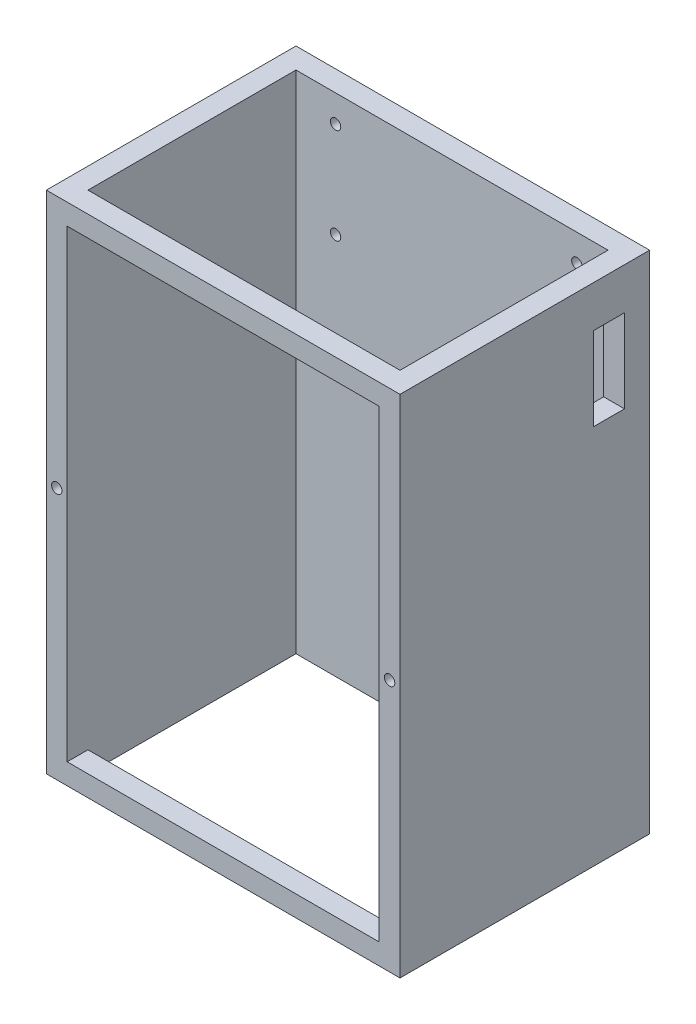
ISO-10303-21;
HEADER;
FILE_DESCRIPTION(('STEP AP214'),'2;1');
FILE_NAME('part.step','',(''),(''),'','','');
FILE_SCHEMA(('AUTOMOTIVE_DESIGN { 1 0 10303 214 1 1 1 1 }'));
ENDSEC;
DATA;
#1=APPLICATION_CONTEXT('core data for automotive mechanical design processes');
#2=APPLICATION_PROTOCOL_DEFINITION('international standard','automotive_design',2000,#1);
#3=PRODUCT_CONTEXT('',#1,'mechanical');
#4=PRODUCT('Part','Part','',(#3));
#5=PRODUCT_RELATED_PRODUCT_CATEGORY('part','',(#4));
#6=PRODUCT_DEFINITION_FORMATION('','',#4);
#7=PRODUCT_DEFINITION_CONTEXT('part definition',#1,'design');
#8=PRODUCT_DEFINITION('design','',#6,#7);
#9=PRODUCT_DEFINITION_SHAPE('','',#8);
#10=(LENGTH_UNIT() NAMED_UNIT(*) SI_UNIT(.MILLI.,.METRE.));
#11=(NAMED_UNIT(*) PLANE_ANGLE_UNIT() SI_UNIT($,.RADIAN.));
#12=(NAMED_UNIT(*) SI_UNIT($,.STERADIAN.) SOLID_ANGLE_UNIT());
#13=UNCERTAINTY_MEASURE_WITH_UNIT(LENGTH_MEASURE(1.E-05),#10,'distance_accuracy_value','');
#14=(GEOMETRIC_REPRESENTATION_CONTEXT(3) GLOBAL_UNCERTAINTY_ASSIGNED_CONTEXT((#13)) GLOBAL_UNIT_ASSIGNED_CONTEXT((#10,
#11,#12)) REPRESENTATION_CONTEXT('',''));
#15=CARTESIAN_POINT('',(0.,0.,0.));
#16=DIRECTION('',(0.,0.,1.));
#17=DIRECTION('',(1.,0.,0.));
#18=AXIS2_PLACEMENT_3D('',#15,#16,#17);
#19=CARTESIAN_POINT('',(48.174237047697,0.,10.426657645341));
#20=DIRECTION('',(1.,0.,0.));
#21=DIRECTION('',(0.,1.,0.));
#22=AXIS2_PLACEMENT_3D('',#19,#20,#21);
#23=PLANE('',#22);
#24=DIRECTION('',(0.,1.,0.));
#25=VECTOR('',#24,1.);
#26=CARTESIAN_POINT('',(48.174237047697,-111.5,11.42665764535));
#27=LINE('',#26,#25);
#28=CARTESIAN_POINT('',(48.174237047697,-116.5,11.42665764535));
#29=VERTEX_POINT('',#28);
#30=CARTESIAN_POINT('',(48.174237047697,-111.5,11.42665764535));
#31=VERTEX_POINT('',#30);
#32=EDGE_CURVE('E274',#29,#31,#27,.T.);
#33=ORIENTED_EDGE('',*,*,#32,.F.);
#34=DIRECTION('',(0.,0.,1.));
#35=VECTOR('',#34,1.);
#36=CARTESIAN_POINT('',(48.174237047697,-116.5,11.42665764535));
#37=LINE('',#36,#35);
#38=CARTESIAN_POINT('',(48.174237047697,-116.5,6.42665764535));
#39=VERTEX_POINT('',#38);
#40=EDGE_CURVE('E280',#39,#29,#37,.T.);
#41=ORIENTED_EDGE('',*,*,#40,.F.);
#42=DIRECTION('',(0.,-1.,0.));
#43=VECTOR('',#42,1.);
#44=CARTESIAN_POINT('',(48.174237047697,-111.5,6.42665764535));
#45=LINE('',#44,#43);
#46=CARTESIAN_POINT('',(48.174237047697,-111.5,6.42665764535));
#47=VERTEX_POINT('',#46);
#48=EDGE_CURVE('E297',#47,#39,#45,.T.);
#49=ORIENTED_EDGE('',*,*,#48,.F.);
#50=DIRECTION('',(0.,0.,-1.));
#51=VECTOR('',#50,1.);
#52=CARTESIAN_POINT('',(48.174237047697,-111.5,11.42665764535));
#53=LINE('',#52,#51);
#54=EDGE_CURVE('E293',#31,#47,#53,.T.);
#55=ORIENTED_EDGE('',*,*,#54,.F.);
#56=EDGE_LOOP('',(#33,#41,#49,#55));
#57=FACE_BOUND('',#56,.T.);
#58=DIRECTION('',(0.,0.,1.));
#59=VECTOR('',#58,1.);
#60=CARTESIAN_POINT('',(48.174237047697,-30.,-18.522203));
#61=LINE('',#60,#59);
#62=CARTESIAN_POINT('',(48.174237047697,-30.,-18.522203));
#63=VERTEX_POINT('',#62);
#64=CARTESIAN_POINT('',(48.174237047697,-30.,-11.022203));
#65=VERTEX_POINT('',#64);
#66=EDGE_CURVE('E441',#63,#65,#61,.T.);
#67=ORIENTED_EDGE('',*,*,#66,.F.);
#68=DIRECTION('',(0.,1.,0.));
#69=VECTOR('',#68,1.);
#70=CARTESIAN_POINT('',(48.174237047697,-23.,-18.522203));
#71=LINE('',#70,#69);
#72=CARTESIAN_POINT('',(48.174237047697,-10.,-18.522203));
#73=VERTEX_POINT('',#72);
#74=EDGE_CURVE('E528',#63,#73,#71,.T.);
#75=ORIENTED_EDGE('',*,*,#74,.T.);
#76=DIRECTION('',(0.,0.,1.));
#77=VECTOR('',#76,1.);
#78=CARTESIAN_POINT('',(48.174237047697,-10.,-18.522203));
#79=LINE('',#78,#77);
#80=CARTESIAN_POINT('',(48.174237047697,-10.,-11.022203));
#81=VERTEX_POINT('',#80);
#82=EDGE_CURVE('E532',#73,#81,#79,.T.);
#83=ORIENTED_EDGE('',*,*,#82,.T.);
#84=DIRECTION('',(0.,-1.,0.));
#85=VECTOR('',#84,1.);
#86=CARTESIAN_POINT('',(48.174237047697,-10.,-11.022203));
#87=LINE('',#86,#85);
#88=EDGE_CURVE('E477',#81,#65,#87,.T.);
#89=ORIENTED_EDGE('',*,*,#88,.T.);
#90=EDGE_LOOP('',(#67,#75,#83,#89));
#91=FACE_BOUND('',#90,.T.);
#92=DIRECTION('',(0.,-1.,0.));
#93=VECTOR('',#92,1.);
#94=CARTESIAN_POINT('',(48.174237047697,0.,30.426657645341));
#95=LINE('',#94,#93);
#96=CARTESIAN_POINT('',(48.174237047697,0.,30.426657645341));
#97=VERTEX_POINT('',#96);
#98=CARTESIAN_POINT('',(48.174237047697,-5.,30.426657645341));
#99=VERTEX_POINT('',#98);
#100=EDGE_CURVE('E341',#97,#99,#95,.T.);
#101=ORIENTED_EDGE('',*,*,#100,.F.);
#102=DIRECTION('',(0.,0.,-1.));
#103=VECTOR('',#102,1.);
#104=CARTESIAN_POINT('',(48.174237047697,0.,10.426657645341));
#105=LINE('',#104,#103);
#106=CARTESIAN_POINT('',(48.174237047697,0.,-19.57334235465));
#107=VERTEX_POINT('',#106);
#108=EDGE_CURVE('E486',#97,#107,#105,.T.);
#109=ORIENTED_EDGE('',*,*,#108,.T.);
#110=DIRECTION('',(0.,-1.,0.));
#111=VECTOR('',#110,1.);
#112=CARTESIAN_POINT('',(48.174237047697,0.,-19.57334235465));
#113=LINE('',#112,#111);
#114=CARTESIAN_POINT('',(48.174237047697,-121.5,-19.57334235465));
#115=VERTEX_POINT('',#114);
#116=EDGE_CURVE('E473',#107,#115,#113,.T.);
#117=ORIENTED_EDGE('',*,*,#116,.T.);
#118=DIRECTION('',(0.,0.,-1.));
#119=VECTOR('',#118,1.);
#120=CARTESIAN_POINT('',(48.174237047697,-121.5,10.426657645341));
#121=LINE('',#120,#119);
#122=CARTESIAN_POINT('',(48.174237047697,-121.5,30.426657645341));
#123=VERTEX_POINT('',#122);
#124=EDGE_CURVE('E499',#123,#115,#121,.T.);
#125=ORIENTED_EDGE('',*,*,#124,.F.);
#126=DIRECTION('',(0.,-1.,0.));
#127=VECTOR('',#126,1.);
#128=CARTESIAN_POINT('',(48.174237047697,-121.5,30.426657645341));
#129=LINE('',#128,#127);
#130=CARTESIAN_POINT('',(48.174237047697,-116.5,30.426657645341));
#131=VERTEX_POINT('',#130);
#132=EDGE_CURVE('E366',#131,#123,#129,.T.);
#133=ORIENTED_EDGE('',*,*,#132,.F.);
#134=DIRECTION('',(0.,0.,-1.));
#135=VECTOR('',#134,1.);
#136=CARTESIAN_POINT('',(48.174237047697,-116.5,35.426657645341));
#137=LINE('',#136,#135);
#138=CARTESIAN_POINT('',(48.174237047697,-116.5,35.426657645341));
#139=VERTEX_POINT('',#138);
#140=EDGE_CURVE('E371',#139,#131,#137,.T.);
#141=ORIENTED_EDGE('',*,*,#140,.F.);
#142=DIRECTION('',(0.,-1.,0.));
#143=VECTOR('',#142,1.);
#144=CARTESIAN_POINT('',(48.174237047697,0.,35.426657645341));
#145=LINE('',#144,#143);
#146=CARTESIAN_POINT('',(48.174237047697,-5.,35.426657645341));
#147=VERTEX_POINT('',#146);
#148=EDGE_CURVE('E391',#147,#139,#145,.T.);
#149=ORIENTED_EDGE('',*,*,#148,.F.);
#150=DIRECTION('',(0.,0.,1.));
#151=VECTOR('',#150,1.);
#152=CARTESIAN_POINT('',(48.174237047697,-5.,35.426657645341));
#153=LINE('',#152,#151);
#154=EDGE_CURVE('E336',#99,#147,#153,.T.);
#155=ORIENTED_EDGE('',*,*,#154,.F.);
#156=EDGE_LOOP('',(#101,#109,#117,#125,#133,#141,#149,#155));
#157=FACE_BOUND('',#156,.T.);
#158=DIRECTION('',(0.,1.,0.));
#159=VECTOR('',#158,1.);
#160=CARTESIAN_POINT('',(48.174237047697,-30.22,11.42665764535));
#161=LINE('',#160,#159);
#162=CARTESIAN_POINT('',(48.174237047697,-35.22,11.42665764535));
#163=VERTEX_POINT('',#162);
#164=CARTESIAN_POINT('',(48.174237047697,-30.22,11.42665764535));
#165=VERTEX_POINT('',#164);
#166=EDGE_CURVE('E258',#163,#165,#161,.T.);
#167=ORIENTED_EDGE('',*,*,#166,.F.);
#168=DIRECTION('',(0.,0.,1.));
#169=VECTOR('',#168,1.);
#170=CARTESIAN_POINT('',(48.174237047697,-35.22,11.42665764535));
#171=LINE('',#170,#169);
#172=CARTESIAN_POINT('',(48.174237047697,-35.22,6.42665764535));
#173=VERTEX_POINT('',#172);
#174=EDGE_CURVE('E255',#173,#163,#171,.T.);
#175=ORIENTED_EDGE('',*,*,#174,.F.);
#176=DIRECTION('',(0.,-1.,0.));
#177=VECTOR('',#176,1.);
#178=CARTESIAN_POINT('',(48.174237047697,-30.22,6.42665764535));
#179=LINE('',#178,#177);
#180=CARTESIAN_POINT('',(48.174237047697,-30.22,6.42665764535));
#181=VERTEX_POINT('',#180);
#182=EDGE_CURVE('E84',#181,#173,#179,.T.);
#183=ORIENTED_EDGE('',*,*,#182,.F.);
#184=DIRECTION('',(0.,0.,-1.));
#185=VECTOR('',#184,1.);
#186=CARTESIAN_POINT('',(48.174237047697,-30.22,11.42665764535));
#187=LINE('',#186,#185);
#188=EDGE_CURVE('E79',#165,#181,#187,.T.);
#189=ORIENTED_EDGE('',*,*,#188,.F.);
#190=EDGE_LOOP('',(#167,#175,#183,#189));
#191=FACE_BOUND('',#190,.T.);
#192=ADVANCED_FACE('F63',(#57,#91,#157,#191),#23,.F.);
#193=CARTESIAN_POINT('',(-26.8257629523,0.,-19.57334235465));
#194=DIRECTION('',(-1.,0.,0.));
#195=DIRECTION('',(0.,0.,1.));
#196=AXIS2_PLACEMENT_3D('',#193,#194,#195);
#197=PLANE('',#196);
#198=DIRECTION('',(0.,-1.,0.));
#199=VECTOR('',#198,1.);
#200=CARTESIAN_POINT('',(-26.8257629523,0.,30.426657645341));
#201=LINE('',#200,#199);
#202=CARTESIAN_POINT('',(-26.8257629523,0.,30.426657645341));
#203=VERTEX_POINT('',#202);
#204=CARTESIAN_POINT('',(-26.8257629523,-5.,30.426657645341));
#205=VERTEX_POINT('',#204);
#206=EDGE_CURVE('E346',#203,#205,#201,.T.);
#207=ORIENTED_EDGE('',*,*,#206,.T.);
#208=DIRECTION('',(0.,0.,1.));
#209=VECTOR('',#208,1.);
#210=CARTESIAN_POINT('',(-26.8257629523,-5.,35.426657645341));
#211=LINE('',#210,#209);
#212=CARTESIAN_POINT('',(-26.8257629523,-5.,35.426657645341));
#213=VERTEX_POINT('',#212);
#214=EDGE_CURVE('E339',#205,#213,#211,.T.);
#215=ORIENTED_EDGE('',*,*,#214,.T.);
#216=DIRECTION('',(0.,1.,0.));
#217=VECTOR('',#216,1.);
#218=CARTESIAN_POINT('',(-26.8257629523,0.,35.426657645341));
#219=LINE('',#218,#217);
#220=CARTESIAN_POINT('',(-26.8257629523,-116.5,35.426657645341));
#221=VERTEX_POINT('',#220);
#222=EDGE_CURVE('E394',#221,#213,#219,.T.);
#223=ORIENTED_EDGE('',*,*,#222,.F.);
#224=DIRECTION('',(0.,0.,-1.));
#225=VECTOR('',#224,1.);
#226=CARTESIAN_POINT('',(-26.8257629523,-116.5,35.426657645341));
#227=LINE('',#226,#225);
#228=CARTESIAN_POINT('',(-26.8257629523,-116.5,30.426657645341));
#229=VERTEX_POINT('',#228);
#230=EDGE_CURVE('E367',#221,#229,#227,.T.);
#231=ORIENTED_EDGE('',*,*,#230,.T.);
#232=DIRECTION('',(0.,-1.,0.));
#233=VECTOR('',#232,1.);
#234=CARTESIAN_POINT('',(-26.8257629523,-121.5,30.426657645341));
#235=LINE('',#234,#233);
#236=CARTESIAN_POINT('',(-26.8257629523,-121.5,30.426657645341));
#237=VERTEX_POINT('',#236);
#238=EDGE_CURVE('E324',#229,#237,#235,.T.);
#239=ORIENTED_EDGE('',*,*,#238,.T.);
#240=DIRECTION('',(0.,0.,1.));
#241=VECTOR('',#240,1.);
#242=CARTESIAN_POINT('',(-26.8257629523,-121.5,-19.57334235465));
#243=LINE('',#242,#241);
#244=CARTESIAN_POINT('',(-26.8257629523,-121.5,-19.57334235465));
#245=VERTEX_POINT('',#244);
#246=EDGE_CURVE('E506',#245,#237,#243,.T.);
#247=ORIENTED_EDGE('',*,*,#246,.F.);
#248=DIRECTION('',(0.,-1.,0.));
#249=VECTOR('',#248,1.);
#250=CARTESIAN_POINT('',(-26.8257629523,0.,-19.57334235465));
#251=LINE('',#250,#249);
#252=CARTESIAN_POINT('',(-26.8257629523,0.,-19.57334235465));
#253=VERTEX_POINT('',#252);
#254=EDGE_CURVE('E513',#253,#245,#251,.T.);
#255=ORIENTED_EDGE('',*,*,#254,.F.);
#256=DIRECTION('',(0.,0.,1.));
#257=VECTOR('',#256,1.);
#258=CARTESIAN_POINT('',(-26.8257629523,0.,-19.57334235465));
#259=LINE('',#258,#257);
#260=EDGE_CURVE('E460',#253,#203,#259,.T.);
#261=ORIENTED_EDGE('',*,*,#260,.T.);
#262=EDGE_LOOP('',(#207,#215,#223,#231,#239,#247,#255,#261));
#263=FACE_BOUND('',#262,.T.);
#264=ADVANCED_FACE('F576',(#263),#197,.F.);
#265=CARTESIAN_POINT('',(53.174237047697,-10.,-18.522203));
#266=DIRECTION('',(0.,1.,0.));
#267=DIRECTION('',(1.,0.,0.));
#268=AXIS2_PLACEMENT_3D('',#265,#266,#267);
#269=PLANE('',#268);
#270=DIRECTION('',(0.,0.,1.));
#271=VECTOR('',#270,1.);
#272=CARTESIAN_POINT('',(53.174237047697,-10.,-18.522203));
#273=LINE('',#272,#271);
#274=CARTESIAN_POINT('',(53.174237047697,-10.,-18.522203));
#275=VERTEX_POINT('',#274);
#276=CARTESIAN_POINT('',(53.174237047697,-10.,-11.022203));
#277=VERTEX_POINT('',#276);
#278=EDGE_CURVE('E519',#275,#277,#273,.T.);
#279=ORIENTED_EDGE('',*,*,#278,.T.);
#280=DIRECTION('',(-1.,0.,0.));
#281=VECTOR('',#280,1.);
#282=CARTESIAN_POINT('',(53.174237047697,-10.,-11.022203));
#283=LINE('',#282,#281);
#284=EDGE_CURVE('E11',#277,#81,#283,.T.);
#285=ORIENTED_EDGE('',*,*,#284,.T.);
#286=ORIENTED_EDGE('',*,*,#82,.F.);
#287=DIRECTION('',(-1.,0.,0.));
#288=VECTOR('',#287,1.);
#289=CARTESIAN_POINT('',(53.174237047697,-10.,-18.522203));
#290=LINE('',#289,#288);
#291=EDGE_CURVE('E67',#275,#73,#290,.T.);
#292=ORIENTED_EDGE('',*,*,#291,.F.);
#293=EDGE_LOOP('',(#279,#285,#286,#292));
#294=FACE_BOUND('',#293,.T.);
#295=ADVANCED_FACE('F65',(#294),#269,.F.);
#296=CARTESIAN_POINT('',(53.174237047697,-10.,-11.022203));
#297=DIRECTION('',(0.,0.,1.));
#298=DIRECTION('',(1.,0.,0.));
#299=AXIS2_PLACEMENT_3D('',#296,#297,#298);
#300=PLANE('',#299);
#301=DIRECTION('',(0.,-1.,0.));
#302=VECTOR('',#301,1.);
#303=CARTESIAN_POINT('',(53.174237047697,-10.,-11.022203));
#304=LINE('',#303,#302);
#305=CARTESIAN_POINT('',(53.174237047697,-30.,-11.022203));
#306=VERTEX_POINT('',#305);
#307=EDGE_CURVE('E516',#277,#306,#304,.T.);
#308=ORIENTED_EDGE('',*,*,#307,.T.);
#309=DIRECTION('',(1.,0.,0.));
#310=VECTOR('',#309,1.);
#311=CARTESIAN_POINT('',(26.8142276844032,-30.,-11.022203));
#312=LINE('',#311,#310);
#313=EDGE_CURVE('E450',#65,#306,#312,.T.);
#314=ORIENTED_EDGE('',*,*,#313,.F.);
#315=ORIENTED_EDGE('',*,*,#88,.F.);
#316=ORIENTED_EDGE('',*,*,#284,.F.);
#317=EDGE_LOOP('',(#308,#314,#315,#316));
#318=FACE_BOUND('',#317,.T.);
#319=ADVANCED_FACE('F553',(#318),#300,.F.);
#320=CARTESIAN_POINT('',(53.174237047697,-23.,-18.522203));
#321=DIRECTION('',(0.,0.,-1.));
#322=DIRECTION('',(-1.,0.,0.));
#323=AXIS2_PLACEMENT_3D('',#320,#321,#322);
#324=PLANE('',#323);
#325=DIRECTION('',(0.,1.,0.));
#326=VECTOR('',#325,1.);
#327=CARTESIAN_POINT('',(53.174237047697,-23.,-18.522203));
#328=LINE('',#327,#326);
#329=CARTESIAN_POINT('',(53.174237047697,-30.,-18.522203));
#330=VERTEX_POINT('',#329);
#331=EDGE_CURVE('E478',#330,#275,#328,.T.);
#332=ORIENTED_EDGE('',*,*,#331,.T.);
#333=ORIENTED_EDGE('',*,*,#291,.T.);
#334=ORIENTED_EDGE('',*,*,#74,.F.);
#335=DIRECTION('',(1.,0.,0.));
#336=VECTOR('',#335,1.);
#337=CARTESIAN_POINT('',(26.8142276844032,-30.,-18.522203));
#338=LINE('',#337,#336);
#339=EDGE_CURVE('E446',#63,#330,#338,.T.);
#340=ORIENTED_EDGE('',*,*,#339,.T.);
#341=EDGE_LOOP('',(#332,#333,#334,#340));
#342=FACE_BOUND('',#341,.T.);
#343=ADVANCED_FACE('F542',(#342),#324,.F.);
#344=CARTESIAN_POINT('',(48.174237047697,0.,-19.57334235465));
#345=DIRECTION('',(0.,0.,-1.));
#346=DIRECTION('',(0.,-1.,0.));
#347=AXIS2_PLACEMENT_3D('',#344,#345,#346);
#348=PLANE('',#347);
#349=CARTESIAN_POINT('',(-17.3144800792656,-6.4999999999983,-19.57334235465));
#350=DIRECTION('',(0.,0.,1.));
#351=DIRECTION('',(1.,0.,0.));
#352=AXIS2_PLACEMENT_3D('',#349,#350,#351);
#353=CIRCLE('',#352,1.25000000000201);
#354=CARTESIAN_POINT('',(-16.0644800792636,-6.4999999999983,-19.57334235465));
#355=VERTEX_POINT('',#354);
#356=EDGE_CURVE('E420',#355,#355,#353,.T.);
#357=ORIENTED_EDGE('',*,*,#356,.F.);
#358=EDGE_LOOP('',(#357));
#359=FACE_BOUND('',#358,.T.);
#360=CARTESIAN_POINT('',(-17.3144800792654,-29.4999999999983,-19.57334235465));
#361=DIRECTION('',(0.,0.,1.));
#362=DIRECTION('',(1.,0.,0.));
#363=AXIS2_PLACEMENT_3D('',#360,#361,#362);
#364=CIRCLE('',#363,1.25000000000183);
#365=CARTESIAN_POINT('',(-16.0644800792636,-29.4999999999983,-19.57334235465));
#366=VERTEX_POINT('',#365);
#367=EDGE_CURVE('E412',#366,#366,#364,.T.);
#368=ORIENTED_EDGE('',*,*,#367,.F.);
#369=EDGE_LOOP('',(#368));
#370=FACE_BOUND('',#369,.T.);
#371=CARTESIAN_POINT('',(40.6855199207344,-6.4999999999979,-19.57334235465));
#372=DIRECTION('',(0.,0.,1.));
#373=DIRECTION('',(1.,0.,0.));
#374=AXIS2_PLACEMENT_3D('',#371,#372,#373);
#375=CIRCLE('',#374,1.25000000000201);
#376=CARTESIAN_POINT('',(41.9355199207364,-6.4999999999979,-19.57334235465));
#377=VERTEX_POINT('',#376);
#378=EDGE_CURVE('E425',#377,#377,#375,.T.);
#379=ORIENTED_EDGE('',*,*,#378,.F.);
#380=EDGE_LOOP('',(#379));
#381=FACE_BOUND('',#380,.T.);
#382=CARTESIAN_POINT('',(40.6855199207346,-29.4999999999979,-19.57334235465));
#383=DIRECTION('',(0.,0.,1.));
#384=DIRECTION('',(1.,0.,0.));
#385=AXIS2_PLACEMENT_3D('',#382,#383,#384);
#386=CIRCLE('',#385,1.25000000000183);
#387=CARTESIAN_POINT('',(41.9355199207364,-29.4999999999979,-19.57334235465));
#388=VERTEX_POINT('',#387);
#389=EDGE_CURVE('E430',#388,#388,#386,.T.);
#390=ORIENTED_EDGE('',*,*,#389,.F.);
#391=EDGE_LOOP('',(#390));
#392=FACE_BOUND('',#391,.T.);
#393=DIRECTION('',(-1.,0.,0.));
#394=VECTOR('',#393,1.);
#395=CARTESIAN_POINT('',(48.174237047697,0.,-19.57334235465));
#396=LINE('',#395,#394);
#397=EDGE_CURVE('E482',#107,#253,#396,.T.);
#398=ORIENTED_EDGE('',*,*,#397,.T.);
#399=ORIENTED_EDGE('',*,*,#254,.T.);
#400=DIRECTION('',(-1.,0.,0.));
#401=VECTOR('',#400,1.);
#402=CARTESIAN_POINT('',(48.174237047697,-121.5,-19.57334235465));
#403=LINE('',#402,#401);
#404=EDGE_CURVE('E502',#115,#245,#403,.T.);
#405=ORIENTED_EDGE('',*,*,#404,.F.);
#406=ORIENTED_EDGE('',*,*,#116,.F.);
#407=EDGE_LOOP('',(#398,#399,#405,#406));
#408=FACE_BOUND('',#407,.T.);
#409=ADVANCED_FACE('F559',(#359,#370,#381,#392,#408),#348,.F.);
#410=CARTESIAN_POINT('',(53.174237047697,0.,-24.57334235465));
#411=DIRECTION('',(-1.,0.,0.));
#412=DIRECTION('',(0.,0.,1.));
#413=AXIS2_PLACEMENT_3D('',#410,#411,#412);
#414=PLANE('',#413);
#415=DIRECTION('',(0.,1.,0.));
#416=VECTOR('',#415,1.);
#417=CARTESIAN_POINT('',(53.174237047697,0.,35.426657645341));
#418=LINE('',#417,#416);
#419=CARTESIAN_POINT('',(53.174237047697,-121.5,35.426657645341));
#420=VERTEX_POINT('',#419);
#421=CARTESIAN_POINT('',(53.174237047697,0.,35.426657645341));
#422=VERTEX_POINT('',#421);
#423=EDGE_CURVE('E350',#420,#422,#418,.T.);
#424=ORIENTED_EDGE('',*,*,#423,.F.);
#425=DIRECTION('',(0.,0.,1.));
#426=VECTOR('',#425,1.);
#427=CARTESIAN_POINT('',(53.174237047697,-121.5,-24.57334235465));
#428=LINE('',#427,#426);
#429=CARTESIAN_POINT('',(53.174237047697,-121.5,-24.57334235465));
#430=VERTEX_POINT('',#429);
#431=EDGE_CURVE('E471',#430,#420,#428,.T.);
#432=ORIENTED_EDGE('',*,*,#431,.F.);
#433=DIRECTION('',(0.,-1.,0.));
#434=VECTOR('',#433,1.);
#435=CARTESIAN_POINT('',(53.174237047697,0.,-24.57334235465));
#436=LINE('',#435,#434);
#437=CARTESIAN_POINT('',(53.174237047697,0.,-24.57334235465));
#438=VERTEX_POINT('',#437);
#439=EDGE_CURVE('E510',#438,#430,#436,.T.);
#440=ORIENTED_EDGE('',*,*,#439,.F.);
#441=DIRECTION('',(0.,0.,1.));
#442=VECTOR('',#441,1.);
#443=CARTESIAN_POINT('',(53.174237047697,0.,-24.57334235465));
#444=LINE('',#443,#442);
#445=EDGE_CURVE('E489',#438,#422,#444,.T.);
#446=ORIENTED_EDGE('',*,*,#445,.T.);
#447=EDGE_LOOP('',(#424,#432,#440,#446));
#448=FACE_BOUND('',#447,.T.);
#449=ORIENTED_EDGE('',*,*,#331,.F.);
#450=DIRECTION('',(0.,0.,-1.));
#451=VECTOR('',#450,1.);
#452=CARTESIAN_POINT('',(53.174237047697,-30.,-18.522203));
#453=LINE('',#452,#451);
#454=EDGE_CURVE('E434',#306,#330,#453,.T.);
#455=ORIENTED_EDGE('',*,*,#454,.F.);
#456=ORIENTED_EDGE('',*,*,#307,.F.);
#457=ORIENTED_EDGE('',*,*,#278,.F.);
#458=EDGE_LOOP('',(#449,#455,#456,#457));
#459=FACE_BOUND('',#458,.T.);
#460=ADVANCED_FACE('F556',(#448,#459),#414,.F.);
#461=CARTESIAN_POINT('',(-31.8257629523,0.,-24.57334235465));
#462=DIRECTION('',(0.,0.,1.));
#463=DIRECTION('',(0.,-1.,0.));
#464=AXIS2_PLACEMENT_3D('',#461,#462,#463);
#465=PLANE('',#464);
#466=CARTESIAN_POINT('',(-17.3144800792656,-6.4999999999983,-24.57334235465));
#467=DIRECTION('',(0.,0.,1.));
#468=DIRECTION('',(0.,-1.,0.));
#469=AXIS2_PLACEMENT_3D('',#466,#467,#468);
#470=CIRCLE('',#469,1.25000000000201);
#471=CARTESIAN_POINT('',(-17.3144800792656,-7.75000000000032,-24.57334235465));
#472=VERTEX_POINT('',#471);
#473=EDGE_CURVE('E416',#472,#472,#470,.F.);
#474=ORIENTED_EDGE('',*,*,#473,.F.);
#475=EDGE_LOOP('',(#474));
#476=FACE_BOUND('',#475,.T.);
#477=CARTESIAN_POINT('',(-17.3144800792654,-29.4999999999983,-24.57334235465));
#478=DIRECTION('',(0.,0.,1.));
#479=DIRECTION('',(0.,-1.,0.));
#480=AXIS2_PLACEMENT_3D('',#477,#478,#479);
#481=CIRCLE('',#480,1.25000000000183);
#482=CARTESIAN_POINT('',(-17.3144800792654,-30.7500000000001,-24.57334235465));
#483=VERTEX_POINT('',#482);
#484=EDGE_CURVE('E402',#483,#483,#481,.F.);
#485=ORIENTED_EDGE('',*,*,#484,.F.);
#486=EDGE_LOOP('',(#485));
#487=FACE_BOUND('',#486,.T.);
#488=CARTESIAN_POINT('',(40.6855199207344,-6.4999999999979,-24.57334235465));
#489=DIRECTION('',(0.,0.,1.));
#490=DIRECTION('',(0.,-1.,0.));
#491=AXIS2_PLACEMENT_3D('',#488,#489,#490);
#492=CIRCLE('',#491,1.25000000000201);
#493=CARTESIAN_POINT('',(40.6855199207344,-7.7499999999999,-24.57334235465));
#494=VERTEX_POINT('',#493);
#495=EDGE_CURVE('E429',#494,#494,#492,.F.);
#496=ORIENTED_EDGE('',*,*,#495,.F.);
#497=EDGE_LOOP('',(#496));
#498=FACE_BOUND('',#497,.T.);
#499=CARTESIAN_POINT('',(40.6855199207346,-29.4999999999979,-24.57334235465));
#500=DIRECTION('',(0.,0.,1.));
#501=DIRECTION('',(0.,-1.,0.));
#502=AXIS2_PLACEMENT_3D('',#499,#500,#501);
#503=CIRCLE('',#502,1.25000000000183);
#504=CARTESIAN_POINT('',(40.6855199207346,-30.7499999999997,-24.57334235465));
#505=VERTEX_POINT('',#504);
#506=EDGE_CURVE('E424',#505,#505,#503,.F.);
#507=ORIENTED_EDGE('',*,*,#506,.F.);
#508=EDGE_LOOP('',(#507));
#509=FACE_BOUND('',#508,.T.);
#510=DIRECTION('',(1.,0.,0.));
#511=VECTOR('',#510,1.);
#512=CARTESIAN_POINT('',(-31.8257629523,0.,-24.57334235465));
#513=LINE('',#512,#511);
#514=CARTESIAN_POINT('',(-31.8257629523,0.,-24.57334235465));
#515=VERTEX_POINT('',#514);
#516=EDGE_CURVE('E472',#515,#438,#513,.T.);
#517=ORIENTED_EDGE('',*,*,#516,.T.);
#518=ORIENTED_EDGE('',*,*,#439,.T.);
#519=DIRECTION('',(1.,0.,0.));
#520=VECTOR('',#519,1.);
#521=CARTESIAN_POINT('',(-31.8257629523,-121.5,-24.57334235465));
#522=LINE('',#521,#520);
#523=CARTESIAN_POINT('',(-31.8257629523,-121.5,-24.57334235465));
#524=VERTEX_POINT('',#523);
#525=EDGE_CURVE('E467',#524,#430,#522,.T.);
#526=ORIENTED_EDGE('',*,*,#525,.F.);
#527=DIRECTION('',(0.,-1.,0.));
#528=VECTOR('',#527,1.);
#529=CARTESIAN_POINT('',(-31.8257629523,0.,-24.57334235465));
#530=LINE('',#529,#528);
#531=EDGE_CURVE('E461',#515,#524,#530,.T.);
#532=ORIENTED_EDGE('',*,*,#531,.F.);
#533=EDGE_LOOP('',(#517,#518,#526,#532));
#534=FACE_BOUND('',#533,.T.);
#535=ADVANCED_FACE('F558',(#476,#487,#498,#509,#534),#465,.F.);
#536=CARTESIAN_POINT('',(10.674237047697,-121.5,-14.07334235465));
#537=DIRECTION('',(0.,1.,0.));
#538=DIRECTION('',(0.,0.,-1.));
#539=AXIS2_PLACEMENT_3D('',#536,#537,#538);
#540=PLANE('',#539);
#541=DIRECTION('',(1.,0.,0.));
#542=VECTOR('',#541,1.);
#543=CARTESIAN_POINT('',(-33.8968307641655,-121.5,30.426657645341));
#544=LINE('',#543,#542);
#545=EDGE_CURVE('E363',#237,#123,#544,.T.);
#546=ORIENTED_EDGE('',*,*,#545,.T.);
#547=ORIENTED_EDGE('',*,*,#124,.T.);
#548=ORIENTED_EDGE('',*,*,#404,.T.);
#549=ORIENTED_EDGE('',*,*,#246,.T.);
#550=EDGE_LOOP('',(#546,#547,#548,#549));
#551=FACE_BOUND('',#550,.T.);
#552=ORIENTED_EDGE('',*,*,#431,.T.);
#553=DIRECTION('',(1.,0.,0.));
#554=VECTOR('',#553,1.);
#555=CARTESIAN_POINT('',(-31.8257629523,-121.5,35.426657645341));
#556=LINE('',#555,#554);
#557=CARTESIAN_POINT('',(-31.8257629523,-121.5,35.426657645341));
#558=VERTEX_POINT('',#557);
#559=EDGE_CURVE('E390',#558,#420,#556,.T.);
#560=ORIENTED_EDGE('',*,*,#559,.F.);
#561=DIRECTION('',(0.,0.,-1.));
#562=VECTOR('',#561,1.);
#563=CARTESIAN_POINT('',(-31.8257629523,-121.5,10.426657645341));
#564=LINE('',#563,#562);
#565=EDGE_CURVE('E457',#558,#524,#564,.T.);
#566=ORIENTED_EDGE('',*,*,#565,.T.);
#567=ORIENTED_EDGE('',*,*,#525,.T.);
#568=EDGE_LOOP('',(#552,#560,#566,#567));
#569=FACE_BOUND('',#568,.T.);
#570=ADVANCED_FACE('F567',(#551,#569),#540,.F.);
#571=CARTESIAN_POINT('',(10.674237047697,0.,-14.07334235465));
#572=DIRECTION('',(0.,1.,0.));
#573=DIRECTION('',(0.,0.,-1.));
#574=AXIS2_PLACEMENT_3D('',#571,#572,#573);
#575=PLANE('',#574);
#576=ORIENTED_EDGE('',*,*,#108,.F.);
#577=DIRECTION('',(1.,0.,0.));
#578=VECTOR('',#577,1.);
#579=CARTESIAN_POINT('',(-33.8968307641655,0.,30.426657645341));
#580=LINE('',#579,#578);
#581=EDGE_CURVE('E345',#203,#97,#580,.T.);
#582=ORIENTED_EDGE('',*,*,#581,.F.);
#583=ORIENTED_EDGE('',*,*,#260,.F.);
#584=ORIENTED_EDGE('',*,*,#397,.F.);
#585=EDGE_LOOP('',(#576,#582,#583,#584));
#586=FACE_BOUND('',#585,.T.);
#587=DIRECTION('',(-1.,0.,0.));
#588=VECTOR('',#587,1.);
#589=CARTESIAN_POINT('',(-31.8257629523,0.,35.426657645341));
#590=LINE('',#589,#588);
#591=CARTESIAN_POINT('',(-31.8257629523,0.,35.426657645341));
#592=VERTEX_POINT('',#591);
#593=EDGE_CURVE('E398',#422,#592,#590,.T.);
#594=ORIENTED_EDGE('',*,*,#593,.F.);
#595=ORIENTED_EDGE('',*,*,#445,.F.);
#596=ORIENTED_EDGE('',*,*,#516,.F.);
#597=DIRECTION('',(0.,0.,-1.));
#598=VECTOR('',#597,1.);
#599=CARTESIAN_POINT('',(-31.8257629523,0.,10.426657645341));
#600=LINE('',#599,#598);
#601=EDGE_CURVE('E445',#592,#515,#600,.T.);
#602=ORIENTED_EDGE('',*,*,#601,.F.);
#603=EDGE_LOOP('',(#594,#595,#596,#602));
#604=FACE_BOUND('',#603,.T.);
#605=ADVANCED_FACE('F631',(#586,#604),#575,.T.);
#606=CARTESIAN_POINT('',(-31.8257629523,0.,10.426657645341));
#607=DIRECTION('',(1.,0.,0.));
#608=DIRECTION('',(0.,1.,0.));
#609=AXIS2_PLACEMENT_3D('',#606,#607,#608);
#610=PLANE('',#609);
#611=ORIENTED_EDGE('',*,*,#601,.T.);
#612=ORIENTED_EDGE('',*,*,#531,.T.);
#613=ORIENTED_EDGE('',*,*,#565,.F.);
#614=DIRECTION('',(0.,-1.,0.));
#615=VECTOR('',#614,1.);
#616=CARTESIAN_POINT('',(-31.8257629523,0.,35.426657645341));
#617=LINE('',#616,#615);
#618=EDGE_CURVE('E386',#592,#558,#617,.T.);
#619=ORIENTED_EDGE('',*,*,#618,.F.);
#620=EDGE_LOOP('',(#611,#612,#613,#619));
#621=FACE_BOUND('',#620,.T.);
#622=ADVANCED_FACE('F637',(#621),#610,.F.);
#623=CARTESIAN_POINT('',(26.8142276844032,-30.,-18.522203));
#624=DIRECTION('',(0.,-1.,0.));
#625=DIRECTION('',(0.,0.,-1.));
#626=AXIS2_PLACEMENT_3D('',#623,#624,#625);
#627=PLANE('',#626);
#628=ORIENTED_EDGE('',*,*,#66,.T.);
#629=ORIENTED_EDGE('',*,*,#313,.T.);
#630=ORIENTED_EDGE('',*,*,#454,.T.);
#631=ORIENTED_EDGE('',*,*,#339,.F.);
#632=EDGE_LOOP('',(#628,#629,#630,#631));
#633=FACE_BOUND('',#632,.T.);
#634=ADVANCED_FACE('F550',(#633),#627,.F.);
#635=CARTESIAN_POINT('',(40.6855199207346,-29.4999999999979,-28.1088762605884));
#636=DIRECTION('',(0.,0.,1.));
#637=DIRECTION('',(1.,0.,0.));
#638=AXIS2_PLACEMENT_3D('',#635,#636,#637);
#639=CYLINDRICAL_SURFACE('',#638,1.25000000000183);
#640=ORIENTED_EDGE('',*,*,#506,.T.);
#641=EDGE_LOOP('',(#640));
#642=FACE_BOUND('',#641,.T.);
#643=ORIENTED_EDGE('',*,*,#389,.T.);
#644=EDGE_LOOP('',(#643));
#645=FACE_BOUND('',#644,.T.);
#646=ADVANCED_FACE('F681',(#642,#645),#639,.F.);
#647=CARTESIAN_POINT('',(40.6855199207344,-6.4999999999979,-28.1088762605884));
#648=DIRECTION('',(0.,0.,1.));
#649=DIRECTION('',(1.,0.,0.));
#650=AXIS2_PLACEMENT_3D('',#647,#648,#649);
#651=CYLINDRICAL_SURFACE('',#650,1.25000000000201);
#652=ORIENTED_EDGE('',*,*,#495,.T.);
#653=EDGE_LOOP('',(#652));
#654=FACE_BOUND('',#653,.T.);
#655=ORIENTED_EDGE('',*,*,#378,.T.);
#656=EDGE_LOOP('',(#655));
#657=FACE_BOUND('',#656,.T.);
#658=ADVANCED_FACE('F690',(#654,#657),#651,.F.);
#659=CARTESIAN_POINT('',(-17.3144800792654,-29.4999999999983,-28.1088762605884));
#660=DIRECTION('',(0.,0.,1.));
#661=DIRECTION('',(1.,0.,0.));
#662=AXIS2_PLACEMENT_3D('',#659,#660,#661);
#663=CYLINDRICAL_SURFACE('',#662,1.25000000000183);
#664=ORIENTED_EDGE('',*,*,#484,.T.);
#665=EDGE_LOOP('',(#664));
#666=FACE_BOUND('',#665,.T.);
#667=ORIENTED_EDGE('',*,*,#367,.T.);
#668=EDGE_LOOP('',(#667));
#669=FACE_BOUND('',#668,.T.);
#670=ADVANCED_FACE('F699',(#666,#669),#663,.F.);
#671=CARTESIAN_POINT('',(-17.3144800792656,-6.4999999999983,-28.1088762605884));
#672=DIRECTION('',(0.,0.,1.));
#673=DIRECTION('',(1.,0.,0.));
#674=AXIS2_PLACEMENT_3D('',#671,#672,#673);
#675=CYLINDRICAL_SURFACE('',#674,1.25000000000201);
#676=ORIENTED_EDGE('',*,*,#473,.T.);
#677=EDGE_LOOP('',(#676));
#678=FACE_BOUND('',#677,.T.);
#679=ORIENTED_EDGE('',*,*,#356,.T.);
#680=EDGE_LOOP('',(#679));
#681=FACE_BOUND('',#680,.T.);
#682=ADVANCED_FACE('F708',(#678,#681),#675,.F.);
#683=CARTESIAN_POINT('',(0.,0.,35.426657645341));
#684=DIRECTION('',(0.,0.,1.));
#685=DIRECTION('',(1.,0.,0.));
#686=AXIS2_PLACEMENT_3D('',#683,#684,#685);
#687=PLANE('',#686);
#688=CARTESIAN_POINT('',(-29.3257629523,-60.75,35.426657645341));
#689=DIRECTION('',(0.,0.,1.));
#690=DIRECTION('',(1.,0.,0.));
#691=AXIS2_PLACEMENT_3D('',#688,#689,#690);
#692=CIRCLE('',#691,1.25);
#693=CARTESIAN_POINT('',(-28.0757629523,-60.75,35.426657645341));
#694=VERTEX_POINT('',#693);
#695=EDGE_CURVE('E325',#694,#694,#692,.T.);
#696=ORIENTED_EDGE('',*,*,#695,.F.);
#697=EDGE_LOOP('',(#696));
#698=FACE_BOUND('',#697,.T.);
#699=CARTESIAN_POINT('',(50.674237047697,-60.75,35.426657645341));
#700=DIRECTION('',(0.,0.,1.));
#701=DIRECTION('',(-1.,0.,0.));
#702=AXIS2_PLACEMENT_3D('',#699,#700,#701);
#703=CIRCLE('',#702,1.25);
#704=CARTESIAN_POINT('',(49.424237047697,-60.75,35.426657645341));
#705=VERTEX_POINT('',#704);
#706=EDGE_CURVE('E329',#705,#705,#703,.T.);
#707=ORIENTED_EDGE('',*,*,#706,.F.);
#708=EDGE_LOOP('',(#707));
#709=FACE_BOUND('',#708,.T.);
#710=ORIENTED_EDGE('',*,*,#423,.T.);
#711=ORIENTED_EDGE('',*,*,#593,.T.);
#712=ORIENTED_EDGE('',*,*,#618,.T.);
#713=ORIENTED_EDGE('',*,*,#559,.T.);
#714=EDGE_LOOP('',(#710,#711,#712,#713));
#715=FACE_BOUND('',#714,.T.);
#716=ORIENTED_EDGE('',*,*,#222,.T.);
#717=DIRECTION('',(1.,0.,0.));
#718=VECTOR('',#717,1.);
#719=CARTESIAN_POINT('',(-33.8968307641655,-5.,35.426657645341));
#720=LINE('',#719,#718);
#721=EDGE_CURVE('E356',#213,#147,#720,.T.);
#722=ORIENTED_EDGE('',*,*,#721,.T.);
#723=ORIENTED_EDGE('',*,*,#148,.T.);
#724=DIRECTION('',(1.,0.,0.));
#725=VECTOR('',#724,1.);
#726=CARTESIAN_POINT('',(-33.8968307641655,-116.5,35.426657645341));
#727=LINE('',#726,#725);
#728=EDGE_CURVE('E362',#221,#139,#727,.T.);
#729=ORIENTED_EDGE('',*,*,#728,.F.);
#730=EDGE_LOOP('',(#716,#722,#723,#729));
#731=FACE_BOUND('',#730,.T.);
#732=ADVANCED_FACE('F716',(#698,#709,#715,#731),#687,.T.);
#733=CARTESIAN_POINT('',(-33.8968307641655,-116.5,35.426657645341));
#734=DIRECTION('',(0.,-1.,0.));
#735=DIRECTION('',(0.,0.,-1.));
#736=AXIS2_PLACEMENT_3D('',#733,#734,#735);
#737=PLANE('',#736);
#738=ORIENTED_EDGE('',*,*,#230,.F.);
#739=ORIENTED_EDGE('',*,*,#728,.T.);
#740=ORIENTED_EDGE('',*,*,#140,.T.);
#741=DIRECTION('',(1.,0.,0.));
#742=VECTOR('',#741,1.);
#743=CARTESIAN_POINT('',(-33.8968307641655,-116.5,30.426657645341));
#744=LINE('',#743,#742);
#745=EDGE_CURVE('E368',#229,#131,#744,.T.);
#746=ORIENTED_EDGE('',*,*,#745,.F.);
#747=EDGE_LOOP('',(#738,#739,#740,#746));
#748=FACE_BOUND('',#747,.T.);
#749=ADVANCED_FACE('F756',(#748),#737,.F.);
#750=CARTESIAN_POINT('',(-33.8968307641655,-121.5,30.426657645341));
#751=DIRECTION('',(0.,0.,1.));
#752=DIRECTION('',(1.,0.,0.));
#753=AXIS2_PLACEMENT_3D('',#750,#751,#752);
#754=PLANE('',#753);
#755=ORIENTED_EDGE('',*,*,#238,.F.);
#756=ORIENTED_EDGE('',*,*,#745,.T.);
#757=ORIENTED_EDGE('',*,*,#132,.T.);
#758=ORIENTED_EDGE('',*,*,#545,.F.);
#759=EDGE_LOOP('',(#755,#756,#757,#758));
#760=FACE_BOUND('',#759,.T.);
#761=ADVANCED_FACE('F892',(#760),#754,.F.);
#762=CARTESIAN_POINT('',(-33.8968307641655,0.,30.426657645341));
#763=DIRECTION('',(0.,0.,1.));
#764=DIRECTION('',(1.,0.,0.));
#765=AXIS2_PLACEMENT_3D('',#762,#763,#764);
#766=PLANE('',#765);
#767=ORIENTED_EDGE('',*,*,#206,.F.);
#768=ORIENTED_EDGE('',*,*,#581,.T.);
#769=ORIENTED_EDGE('',*,*,#100,.T.);
#770=DIRECTION('',(1.,0.,0.));
#771=VECTOR('',#770,1.);
#772=CARTESIAN_POINT('',(-33.8968307641655,-5.,30.426657645341));
#773=LINE('',#772,#771);
#774=EDGE_CURVE('E340',#205,#99,#773,.T.);
#775=ORIENTED_EDGE('',*,*,#774,.F.);
#776=EDGE_LOOP('',(#767,#768,#769,#775));
#777=FACE_BOUND('',#776,.T.);
#778=ADVANCED_FACE('F882',(#777),#766,.F.);
#779=CARTESIAN_POINT('',(-33.8968307641655,-5.,35.426657645341));
#780=DIRECTION('',(0.,1.,0.));
#781=DIRECTION('',(0.,0.,1.));
#782=AXIS2_PLACEMENT_3D('',#779,#780,#781);
#783=PLANE('',#782);
#784=ORIENTED_EDGE('',*,*,#214,.F.);
#785=ORIENTED_EDGE('',*,*,#774,.T.);
#786=ORIENTED_EDGE('',*,*,#154,.T.);
#787=ORIENTED_EDGE('',*,*,#721,.F.);
#788=EDGE_LOOP('',(#784,#785,#786,#787));
#789=FACE_BOUND('',#788,.T.);
#790=ADVANCED_FACE('F872',(#789),#783,.F.);
#791=CARTESIAN_POINT('',(50.674237047697,-60.75,25.426657645341));
#792=DIRECTION('',(0.,0.,1.));
#793=DIRECTION('',(1.,0.,0.));
#794=AXIS2_PLACEMENT_3D('',#791,#792,#793);
#795=CYLINDRICAL_SURFACE('',#794,1.25);
#796=CARTESIAN_POINT('',(50.674237047697,-60.75,25.426657645341));
#797=DIRECTION('',(0.,0.,1.));
#798=DIRECTION('',(-1.,0.,0.));
#799=AXIS2_PLACEMENT_3D('',#796,#797,#798);
#800=CIRCLE('',#799,1.25);
#801=CARTESIAN_POINT('',(49.424237047697,-60.75,25.426657645341));
#802=VERTEX_POINT('',#801);
#803=EDGE_CURVE('E319',#802,#802,#800,.T.);
#804=ORIENTED_EDGE('',*,*,#803,.F.);
#805=EDGE_LOOP('',(#804));
#806=FACE_BOUND('',#805,.T.);
#807=ORIENTED_EDGE('',*,*,#706,.T.);
#808=EDGE_LOOP('',(#807));
#809=FACE_BOUND('',#808,.T.);
#810=ADVANCED_FACE('F862',(#806,#809),#795,.F.);
#811=CARTESIAN_POINT('',(50.674237047697,-60.75,25.426657645341));
#812=DIRECTION('',(0.,0.,-1.));
#813=DIRECTION('',(-1.,0.,0.));
#814=AXIS2_PLACEMENT_3D('',#811,#812,#813);
#815=PLANE('',#814);
#816=ORIENTED_EDGE('',*,*,#803,.T.);
#817=EDGE_LOOP('',(#816));
#818=FACE_BOUND('',#817,.T.);
#819=ADVANCED_FACE('F852',(#818),#815,.F.);
#820=CARTESIAN_POINT('',(-29.3257629523,-60.75,25.426657645341));
#821=DIRECTION('',(0.,0.,1.));
#822=DIRECTION('',(1.,0.,0.));
#823=AXIS2_PLACEMENT_3D('',#820,#821,#822);
#824=CYLINDRICAL_SURFACE('',#823,1.25);
#825=CARTESIAN_POINT('',(-29.3257629523,-60.75,25.426657645341));
#826=DIRECTION('',(0.,0.,1.));
#827=DIRECTION('',(1.,0.,0.));
#828=AXIS2_PLACEMENT_3D('',#825,#826,#827);
#829=CIRCLE('',#828,1.25);
#830=CARTESIAN_POINT('',(-28.0757629523,-60.75,25.426657645341));
#831=VERTEX_POINT('',#830);
#832=EDGE_CURVE('E320',#831,#831,#829,.T.);
#833=ORIENTED_EDGE('',*,*,#832,.F.);
#834=EDGE_LOOP('',(#833));
#835=FACE_BOUND('',#834,.T.);
#836=ORIENTED_EDGE('',*,*,#695,.T.);
#837=EDGE_LOOP('',(#836));
#838=FACE_BOUND('',#837,.T.);
#839=ADVANCED_FACE('F842',(#835,#838),#824,.F.);
#840=CARTESIAN_POINT('',(-29.3257629523,-60.75,25.426657645341));
#841=DIRECTION('',(0.,0.,1.));
#842=DIRECTION('',(1.,0.,0.));
#843=AXIS2_PLACEMENT_3D('',#840,#841,#842);
#844=PLANE('',#843);
#845=ORIENTED_EDGE('',*,*,#832,.T.);
#846=EDGE_LOOP('',(#845));
#847=FACE_BOUND('',#846,.T.);
#848=ADVANCED_FACE('F833',(#847),#844,.T.);
#849=CARTESIAN_POINT('',(38.174237047697,-111.5,11.42665764535));
#850=DIRECTION('',(0.,0.,-1.));
#851=DIRECTION('',(-1.,0.,0.));
#852=AXIS2_PLACEMENT_3D('',#849,#850,#851);
#853=PLANE('',#852);
#854=CARTESIAN_POINT('',(41.174237047697,-114.,11.42665764535));
#855=DIRECTION('',(0.,0.,1.));
#856=DIRECTION('',(1.,0.,0.));
#857=AXIS2_PLACEMENT_3D('',#854,#855,#856);
#858=CIRCLE('',#857,1.25);
#859=CARTESIAN_POINT('',(42.424237047697,-114.,11.42665764535));
#860=VERTEX_POINT('',#859);
#861=EDGE_CURVE('E260',#860,#860,#858,.T.);
#862=ORIENTED_EDGE('',*,*,#861,.F.);
#863=EDGE_LOOP('',(#862));
#864=FACE_BOUND('',#863,.T.);
#865=ORIENTED_EDGE('',*,*,#32,.T.);
#866=DIRECTION('',(1.,0.,0.));
#867=VECTOR('',#866,1.);
#868=CARTESIAN_POINT('',(38.174237047697,-111.5,11.42665764535));
#869=LINE('',#868,#867);
#870=CARTESIAN_POINT('',(38.174237047697,-111.5,11.42665764535));
#871=VERTEX_POINT('',#870);
#872=EDGE_CURVE('E315',#871,#31,#869,.T.);
#873=ORIENTED_EDGE('',*,*,#872,.F.);
#874=DIRECTION('',(0.,1.,0.));
#875=VECTOR('',#874,1.);
#876=CARTESIAN_POINT('',(38.174237047697,-111.5,11.42665764535));
#877=LINE('',#876,#875);
#878=CARTESIAN_POINT('',(38.174237047697,-116.5,11.42665764535));
#879=VERTEX_POINT('',#878);
#880=EDGE_CURVE('E275',#879,#871,#877,.T.);
#881=ORIENTED_EDGE('',*,*,#880,.F.);
#882=DIRECTION('',(1.,0.,0.));
#883=VECTOR('',#882,1.);
#884=CARTESIAN_POINT('',(38.174237047697,-116.5,11.42665764535));
#885=LINE('',#884,#883);
#886=EDGE_CURVE('E289',#879,#29,#885,.T.);
#887=ORIENTED_EDGE('',*,*,#886,.T.);
#888=EDGE_LOOP('',(#865,#873,#881,#887));
#889=FACE_BOUND('',#888,.T.);
#890=ADVANCED_FACE('F823',(#864,#889),#853,.F.);
#891=CARTESIAN_POINT('',(38.174237047697,-111.5,11.42665764535));
#892=DIRECTION('',(0.,-1.,0.));
#893=DIRECTION('',(0.,0.,-1.));
#894=AXIS2_PLACEMENT_3D('',#891,#892,#893);
#895=PLANE('',#894);
#896=ORIENTED_EDGE('',*,*,#54,.T.);
#897=DIRECTION('',(1.,0.,0.));
#898=VECTOR('',#897,1.);
#899=CARTESIAN_POINT('',(38.174237047697,-111.5,6.42665764535));
#900=LINE('',#899,#898);
#901=CARTESIAN_POINT('',(38.174237047697,-111.5,6.42665764535));
#902=VERTEX_POINT('',#901);
#903=EDGE_CURVE('E311',#902,#47,#900,.T.);
#904=ORIENTED_EDGE('',*,*,#903,.F.);
#905=DIRECTION('',(0.,0.,-1.));
#906=VECTOR('',#905,1.);
#907=CARTESIAN_POINT('',(38.174237047697,-111.5,11.42665764535));
#908=LINE('',#907,#906);
#909=EDGE_CURVE('E279',#871,#902,#908,.T.);
#910=ORIENTED_EDGE('',*,*,#909,.F.);
#911=ORIENTED_EDGE('',*,*,#872,.T.);
#912=EDGE_LOOP('',(#896,#904,#910,#911));
#913=FACE_BOUND('',#912,.T.);
#914=ADVANCED_FACE('F814',(#913),#895,.F.);
#915=CARTESIAN_POINT('',(38.174237047697,-111.5,6.42665764535));
#916=DIRECTION('',(0.,0.,1.));
#917=DIRECTION('',(1.,0.,0.));
#918=AXIS2_PLACEMENT_3D('',#915,#916,#917);
#919=PLANE('',#918);
#920=CARTESIAN_POINT('',(41.174237047697,-114.,6.42665764535));
#921=DIRECTION('',(0.,0.,1.));
#922=DIRECTION('',(1.,0.,0.));
#923=AXIS2_PLACEMENT_3D('',#920,#921,#922);
#924=CIRCLE('',#923,1.25);
#925=CARTESIAN_POINT('',(42.424237047697,-114.,6.42665764535));
#926=VERTEX_POINT('',#925);
#927=EDGE_CURVE('E265',#926,#926,#924,.F.);
#928=ORIENTED_EDGE('',*,*,#927,.F.);
#929=EDGE_LOOP('',(#928));
#930=FACE_BOUND('',#929,.T.);
#931=ORIENTED_EDGE('',*,*,#48,.T.);
#932=DIRECTION('',(1.,0.,0.));
#933=VECTOR('',#932,1.);
#934=CARTESIAN_POINT('',(38.174237047697,-116.5,6.42665764535));
#935=LINE('',#934,#933);
#936=CARTESIAN_POINT('',(38.174237047697,-116.5,6.42665764535));
#937=VERTEX_POINT('',#936);
#938=EDGE_CURVE('E307',#937,#39,#935,.T.);
#939=ORIENTED_EDGE('',*,*,#938,.F.);
#940=DIRECTION('',(0.,-1.,0.));
#941=VECTOR('',#940,1.);
#942=CARTESIAN_POINT('',(38.174237047697,-111.5,6.42665764535));
#943=LINE('',#942,#941);
#944=EDGE_CURVE('E283',#902,#937,#943,.T.);
#945=ORIENTED_EDGE('',*,*,#944,.F.);
#946=ORIENTED_EDGE('',*,*,#903,.T.);
#947=EDGE_LOOP('',(#931,#939,#945,#946));
#948=FACE_BOUND('',#947,.T.);
#949=ADVANCED_FACE('F804',(#930,#948),#919,.F.);
#950=CARTESIAN_POINT('',(38.174237047697,-116.5,11.42665764535));
#951=DIRECTION('',(0.,1.,0.));
#952=DIRECTION('',(0.,0.,1.));
#953=AXIS2_PLACEMENT_3D('',#950,#951,#952);
#954=PLANE('',#953);
#955=ORIENTED_EDGE('',*,*,#40,.T.);
#956=ORIENTED_EDGE('',*,*,#886,.F.);
#957=DIRECTION('',(0.,0.,1.));
#958=VECTOR('',#957,1.);
#959=CARTESIAN_POINT('',(38.174237047697,-116.5,11.42665764535));
#960=LINE('',#959,#958);
#961=EDGE_CURVE('E286',#937,#879,#960,.T.);
#962=ORIENTED_EDGE('',*,*,#961,.F.);
#963=ORIENTED_EDGE('',*,*,#938,.T.);
#964=EDGE_LOOP('',(#955,#956,#962,#963));
#965=FACE_BOUND('',#964,.T.);
#966=ADVANCED_FACE('F793',(#965),#954,.F.);
#967=CARTESIAN_POINT('',(38.174237047697,0.,0.));
#968=DIRECTION('',(1.,0.,0.));
#969=DIRECTION('',(0.,0.,-1.));
#970=AXIS2_PLACEMENT_3D('',#967,#968,#969);
#971=PLANE('',#970);
#972=ORIENTED_EDGE('',*,*,#880,.T.);
#973=ORIENTED_EDGE('',*,*,#909,.T.);
#974=ORIENTED_EDGE('',*,*,#944,.T.);
#975=ORIENTED_EDGE('',*,*,#961,.T.);
#976=EDGE_LOOP('',(#972,#973,#974,#975));
#977=FACE_BOUND('',#976,.T.);
#978=ADVANCED_FACE('F781',(#977),#971,.F.);
#979=CARTESIAN_POINT('',(41.174237047697,-114.,2.89112373941726));
#980=DIRECTION('',(0.,0.,1.));
#981=DIRECTION('',(1.,0.,0.));
#982=AXIS2_PLACEMENT_3D('',#979,#980,#981);
#983=CYLINDRICAL_SURFACE('',#982,1.25);
#984=ORIENTED_EDGE('',*,*,#927,.T.);
#985=EDGE_LOOP('',(#984));
#986=FACE_BOUND('',#985,.T.);
#987=ORIENTED_EDGE('',*,*,#861,.T.);
#988=EDGE_LOOP('',(#987));
#989=FACE_BOUND('',#988,.T.);
#990=ADVANCED_FACE('F776',(#986,#989),#983,.F.);
#991=CARTESIAN_POINT('',(38.174237047697,-30.22,11.42665764535));
#992=DIRECTION('',(0.,0.,-1.));
#993=DIRECTION('',(-1.,0.,0.));
#994=AXIS2_PLACEMENT_3D('',#991,#992,#993);
#995=PLANE('',#994);
#996=CARTESIAN_POINT('',(41.174237047697,-32.72,11.42665764535));
#997=DIRECTION('',(0.,0.,1.));
#998=DIRECTION('',(1.,0.,0.));
#999=AXIS2_PLACEMENT_3D('',#996,#997,#998);
#1000=CIRCLE('',#999,1.25);
#1001=CARTESIAN_POINT('',(42.424237047697,-32.72,11.42665764535));
#1002=VERTEX_POINT('',#1001);
#1003=EDGE_CURVE('E948',#1002,#1002,#1000,.T.);
#1004=ORIENTED_EDGE('',*,*,#1003,.F.);
#1005=EDGE_LOOP('',(#1004));
#1006=FACE_BOUND('',#1005,.T.);
#1007=ORIENTED_EDGE('',*,*,#166,.T.);
#1008=DIRECTION('',(1.,0.,0.));
#1009=VECTOR('',#1008,1.);
#1010=CARTESIAN_POINT('',(38.174237047697,-30.22,11.42665764535));
#1011=LINE('',#1010,#1009);
#1012=CARTESIAN_POINT('',(38.174237047697,-30.22,11.42665764535));
#1013=VERTEX_POINT('',#1012);
#1014=EDGE_CURVE('E237',#1013,#165,#1011,.T.);
#1015=ORIENTED_EDGE('',*,*,#1014,.F.);
#1016=DIRECTION('',(0.,1.,0.));
#1017=VECTOR('',#1016,1.);
#1018=CARTESIAN_POINT('',(38.174237047697,-30.22,11.42665764535));
#1019=LINE('',#1018,#1017);
#1020=CARTESIAN_POINT('',(38.174237047697,-35.22,11.42665764535));
#1021=VERTEX_POINT('',#1020);
#1022=EDGE_CURVE('E245',#1021,#1013,#1019,.T.);
#1023=ORIENTED_EDGE('',*,*,#1022,.F.);
#1024=DIRECTION('',(1.,0.,0.));
#1025=VECTOR('',#1024,1.);
#1026=CARTESIAN_POINT('',(38.174237047697,-35.22,11.42665764535));
#1027=LINE('',#1026,#1025);
#1028=EDGE_CURVE('E958',#1021,#163,#1027,.T.);
#1029=ORIENTED_EDGE('',*,*,#1028,.T.);
#1030=EDGE_LOOP('',(#1007,#1015,#1023,#1029));
#1031=FACE_BOUND('',#1030,.T.);
#1032=ADVANCED_FACE('F257',(#1006,#1031),#995,.F.);
#1033=CARTESIAN_POINT('',(38.174237047697,-30.22,11.42665764535));
#1034=DIRECTION('',(0.,-1.,0.));
#1035=DIRECTION('',(0.,0.,-1.));
#1036=AXIS2_PLACEMENT_3D('',#1033,#1034,#1035);
#1037=PLANE('',#1036);
#1038=ORIENTED_EDGE('',*,*,#188,.T.);
#1039=DIRECTION('',(1.,0.,0.));
#1040=VECTOR('',#1039,1.);
#1041=CARTESIAN_POINT('',(38.174237047697,-30.22,6.42665764535));
#1042=LINE('',#1041,#1040);
#1043=CARTESIAN_POINT('',(38.174237047697,-30.22,6.42665764535));
#1044=VERTEX_POINT('',#1043);
#1045=EDGE_CURVE('E240',#1044,#181,#1042,.T.);
#1046=ORIENTED_EDGE('',*,*,#1045,.F.);
#1047=DIRECTION('',(0.,0.,-1.));
#1048=VECTOR('',#1047,1.);
#1049=CARTESIAN_POINT('',(38.174237047697,-30.22,11.42665764535));
#1050=LINE('',#1049,#1048);
#1051=EDGE_CURVE('E233',#1013,#1044,#1050,.T.);
#1052=ORIENTED_EDGE('',*,*,#1051,.F.);
#1053=ORIENTED_EDGE('',*,*,#1014,.T.);
#1054=EDGE_LOOP('',(#1038,#1046,#1052,#1053));
#1055=FACE_BOUND('',#1054,.T.);
#1056=ADVANCED_FACE('F235',(#1055),#1037,.F.);
#1057=CARTESIAN_POINT('',(38.174237047697,-30.22,6.42665764535));
#1058=DIRECTION('',(0.,0.,1.));
#1059=DIRECTION('',(1.,0.,0.));
#1060=AXIS2_PLACEMENT_3D('',#1057,#1058,#1059);
#1061=PLANE('',#1060);
#1062=CARTESIAN_POINT('',(41.174237047697,-32.72,6.42665764535));
#1063=DIRECTION('',(0.,0.,1.));
#1064=DIRECTION('',(1.,0.,0.));
#1065=AXIS2_PLACEMENT_3D('',#1062,#1063,#1064);
#1066=CIRCLE('',#1065,1.25);
#1067=CARTESIAN_POINT('',(42.424237047697,-32.72,6.42665764535));
#1068=VERTEX_POINT('',#1067);
#1069=EDGE_CURVE('E945',#1068,#1068,#1066,.F.);
#1070=ORIENTED_EDGE('',*,*,#1069,.F.);
#1071=EDGE_LOOP('',(#1070));
#1072=FACE_BOUND('',#1071,.T.);
#1073=ORIENTED_EDGE('',*,*,#182,.T.);
#1074=DIRECTION('',(1.,0.,0.));
#1075=VECTOR('',#1074,1.);
#1076=CARTESIAN_POINT('',(38.174237047697,-35.22,6.42665764535));
#1077=LINE('',#1076,#1075);
#1078=CARTESIAN_POINT('',(38.174237047697,-35.22,6.42665764535));
#1079=VERTEX_POINT('',#1078);
#1080=EDGE_CURVE('E267',#1079,#173,#1077,.T.);
#1081=ORIENTED_EDGE('',*,*,#1080,.F.);
#1082=DIRECTION('',(0.,-1.,0.));
#1083=VECTOR('',#1082,1.);
#1084=CARTESIAN_POINT('',(38.174237047697,-30.22,6.42665764535));
#1085=LINE('',#1084,#1083);
#1086=EDGE_CURVE('E244',#1044,#1079,#1085,.T.);
#1087=ORIENTED_EDGE('',*,*,#1086,.F.);
#1088=ORIENTED_EDGE('',*,*,#1045,.T.);
#1089=EDGE_LOOP('',(#1073,#1081,#1087,#1088));
#1090=FACE_BOUND('',#1089,.T.);
#1091=ADVANCED_FACE('F927',(#1072,#1090),#1061,.F.);
#1092=CARTESIAN_POINT('',(38.174237047697,-35.22,11.42665764535));
#1093=DIRECTION('',(0.,1.,0.));
#1094=DIRECTION('',(0.,0.,1.));
#1095=AXIS2_PLACEMENT_3D('',#1092,#1093,#1094);
#1096=PLANE('',#1095);
#1097=ORIENTED_EDGE('',*,*,#174,.T.);
#1098=ORIENTED_EDGE('',*,*,#1028,.F.);
#1099=DIRECTION('',(0.,0.,1.));
#1100=VECTOR('',#1099,1.);
#1101=CARTESIAN_POINT('',(38.174237047697,-35.22,11.42665764535));
#1102=LINE('',#1101,#1100);
#1103=EDGE_CURVE('E250',#1079,#1021,#1102,.T.);
#1104=ORIENTED_EDGE('',*,*,#1103,.F.);
#1105=ORIENTED_EDGE('',*,*,#1080,.T.);
#1106=EDGE_LOOP('',(#1097,#1098,#1104,#1105));
#1107=FACE_BOUND('',#1106,.T.);
#1108=ADVANCED_FACE('F930',(#1107),#1096,.F.);
#1109=CARTESIAN_POINT('',(38.174237047697,81.28,0.));
#1110=DIRECTION('',(1.,0.,0.));
#1111=DIRECTION('',(0.,0.,-1.));
#1112=AXIS2_PLACEMENT_3D('',#1109,#1110,#1111);
#1113=PLANE('',#1112);
#1114=ORIENTED_EDGE('',*,*,#1022,.T.);
#1115=ORIENTED_EDGE('',*,*,#1051,.T.);
#1116=ORIENTED_EDGE('',*,*,#1086,.T.);
#1117=ORIENTED_EDGE('',*,*,#1103,.T.);
#1118=EDGE_LOOP('',(#1114,#1115,#1116,#1117));
#1119=FACE_BOUND('',#1118,.T.);
#1120=ADVANCED_FACE('F248',(#1119),#1113,.F.);
#1121=CARTESIAN_POINT('',(41.174237047697,-32.72,2.89112373941726));
#1122=DIRECTION('',(0.,0.,1.));
#1123=DIRECTION('',(1.,0.,0.));
#1124=AXIS2_PLACEMENT_3D('',#1121,#1122,#1123);
#1125=CYLINDRICAL_SURFACE('',#1124,1.25);
#1126=ORIENTED_EDGE('',*,*,#1069,.T.);
#1127=EDGE_LOOP('',(#1126));
#1128=FACE_BOUND('',#1127,.T.);
#1129=ORIENTED_EDGE('',*,*,#1003,.T.);
#1130=EDGE_LOOP('',(#1129));
#1131=FACE_BOUND('',#1130,.T.);
#1132=ADVANCED_FACE('F937',(#1128,#1131),#1125,.F.);
#1133=CLOSED_SHELL('',(#192,#264,#295,#319,#343,#409,#460,#535,#570,#605,#622,#634,#646,#658,
#670,#682,#732,#749,#761,#778,#790,#810,#819,#839,#848,#890,#914,#949,#966,#978,#990,#1032,
#1056,#1091,#1108,#1120,#1132));
#1134=MANIFOLD_SOLID_BREP('B2',#1133);
#1135=ADVANCED_BREP_SHAPE_REPRESENTATION('',(#18,#1134),#14);
#1136=SHAPE_DEFINITION_REPRESENTATION(#9,#1135);
ENDSEC;
END-ISO-10303-21;
